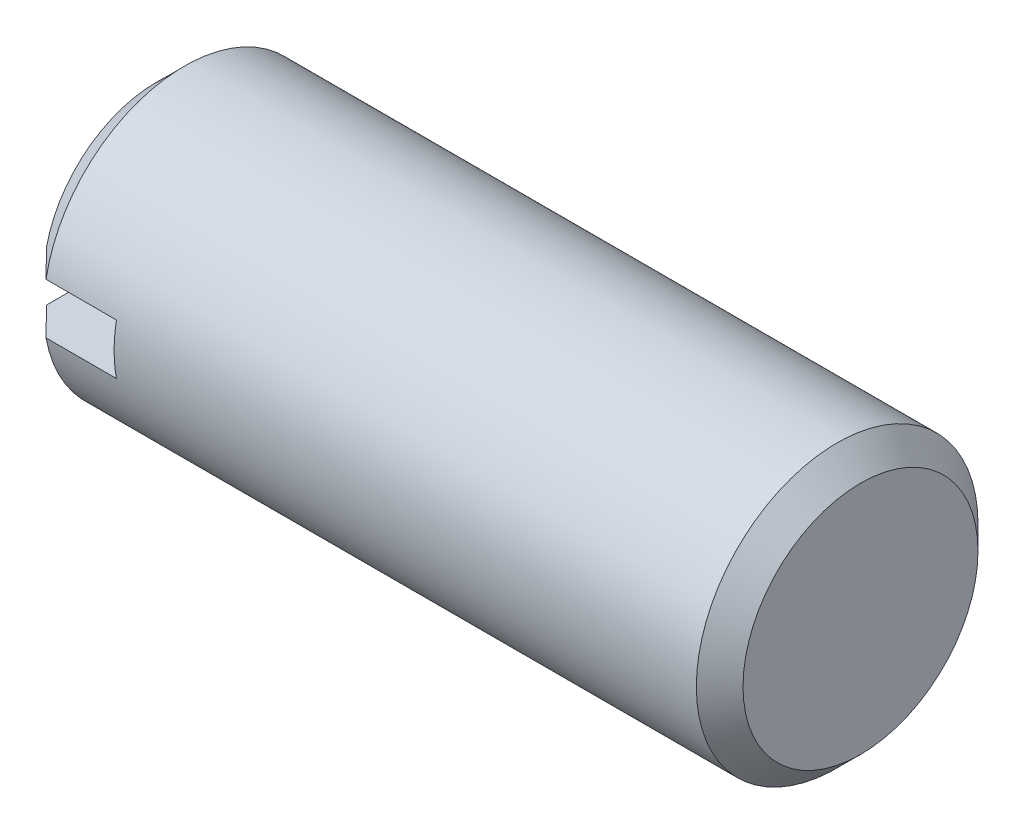
ISO-10303-21;
HEADER;
FILE_DESCRIPTION(('STEP AP214'),'2;1');
FILE_NAME('part.step','',(''),(''),'','','');
FILE_SCHEMA(('AUTOMOTIVE_DESIGN { 1 0 10303 214 1 1 1 1 }'));
ENDSEC;
DATA;
#1=APPLICATION_CONTEXT('core data for automotive mechanical design processes');
#2=APPLICATION_PROTOCOL_DEFINITION('international standard','automotive_design',2000,#1);
#3=PRODUCT_CONTEXT('',#1,'mechanical');
#4=PRODUCT('Part','Part','',(#3));
#5=PRODUCT_RELATED_PRODUCT_CATEGORY('part','',(#4));
#6=PRODUCT_DEFINITION_FORMATION('','',#4);
#7=PRODUCT_DEFINITION_CONTEXT('part definition',#1,'design');
#8=PRODUCT_DEFINITION('design','',#6,#7);
#9=PRODUCT_DEFINITION_SHAPE('','',#8);
#10=(LENGTH_UNIT() NAMED_UNIT(*) SI_UNIT(.MILLI.,.METRE.));
#11=(NAMED_UNIT(*) PLANE_ANGLE_UNIT() SI_UNIT($,.RADIAN.));
#12=(NAMED_UNIT(*) SI_UNIT($,.STERADIAN.) SOLID_ANGLE_UNIT());
#13=UNCERTAINTY_MEASURE_WITH_UNIT(LENGTH_MEASURE(1.E-05),#10,'distance_accuracy_value','');
#14=(GEOMETRIC_REPRESENTATION_CONTEXT(3) GLOBAL_UNCERTAINTY_ASSIGNED_CONTEXT((#13)) GLOBAL_UNIT_ASSIGNED_CONTEXT((#10,
#11,#12)) REPRESENTATION_CONTEXT('',''));
#15=CARTESIAN_POINT('',(0.,0.,0.));
#16=DIRECTION('',(0.,0.,1.));
#17=DIRECTION('',(1.,0.,0.));
#18=AXIS2_PLACEMENT_3D('',#15,#16,#17);
#19=CARTESIAN_POINT('',(0.,0.,0.));
#20=DIRECTION('',(-1.,0.,0.));
#21=DIRECTION('',(0.,0.,1.));
#22=AXIS2_PLACEMENT_3D('',#19,#20,#21);
#23=PLANE('',#22);
#24=DIRECTION('',(0.,0.,1.));
#25=VECTOR('',#24,1.);
#26=CARTESIAN_POINT('',(0.,0.9,-5.));
#27=LINE('',#26,#25);
#28=CARTESIAN_POINT('',(0.,0.9,-3.89743505398102));
#29=VERTEX_POINT('',#28);
#30=CARTESIAN_POINT('',(0.,0.9,3.89743505398102));
#31=VERTEX_POINT('',#30);
#32=EDGE_CURVE('E107',#29,#31,#27,.T.);
#33=ORIENTED_EDGE('',*,*,#32,.T.);
#34=CARTESIAN_POINT('',(0.,0.,0.));
#35=DIRECTION('',(-1.,0.,0.));
#36=DIRECTION('',(0.,0.,1.));
#37=AXIS2_PLACEMENT_3D('',#34,#35,#36);
#38=CIRCLE('',#37,4.);
#39=EDGE_CURVE('E95',#31,#29,#38,.T.);
#40=ORIENTED_EDGE('',*,*,#39,.T.);
#41=EDGE_LOOP('',(#33,#40));
#42=FACE_BOUND('',#41,.T.);
#43=ADVANCED_FACE('F32',(#42),#23,.T.);
#44=CARTESIAN_POINT('',(0.,0.,0.));
#45=DIRECTION('',(1.,0.,0.));
#46=DIRECTION('',(0.,0.,-1.));
#47=AXIS2_PLACEMENT_3D('',#44,#45,#46);
#48=CONICAL_SURFACE('',#47,4.,0.785398163397443);
#49=CARTESIAN_POINT('',(7.03012537267255,0.9,10.9933464303129));
#50=CARTESIAN_POINT('',(6.63966757322609,0.9,10.6015706341639));
#51=CARTESIAN_POINT('',(6.24926843018561,0.9,10.2097363094739));
#52=CARTESIAN_POINT('',(5.46864929228554,0.9,9.4258507538405));
#53=CARTESIAN_POINT('',(5.07842930721639,0.9,9.03379951314809));
#54=CARTESIAN_POINT('',(4.29780491007203,0.9,8.2489524542369));
#55=CARTESIAN_POINT('',(3.90740083067005,0.9,7.85615630504098));
#56=CARTESIAN_POINT('',(3.12704713270239,0.9,7.07015018946809));
#57=CARTESIAN_POINT('',(2.73709749322908,0.9,6.67694024385177));
#58=CARTESIAN_POINT('',(1.9790862064757,0.9,5.91120220689586));
#59=CARTESIAN_POINT('',(1.61098679634444,0.9,5.5387115345953));
#60=CARTESIAN_POINT('',(1.05967971113754,0.9,4.9790923375876));
#61=CARTESIAN_POINT('',(0.876037726528355,0.9,4.79239182808395));
#62=CARTESIAN_POINT('',(0.509170265698786,0.9,4.41858689609271));
#63=CARTESIAN_POINT('',(0.325944783842471,0.9,4.23148247913824));
#64=CARTESIAN_POINT('',(-0.0397740672911054,0.9,3.85681926652623));
#65=CARTESIAN_POINT('',(-0.222267865596271,0.9,3.66926089023119));
#66=CARTESIAN_POINT('',(-0.586330083039388,0.9,3.29322885592932));
#67=CARTESIAN_POINT('',(-0.767898452998071,0.9,3.10475515029816));
#68=CARTESIAN_POINT('',(-1.12946116157851,0.9,2.72638707320926));
#69=CARTESIAN_POINT('',(-1.30945588714665,0.9,2.5364930735902));
#70=CARTESIAN_POINT('',(-1.57726099928195,0.9,2.24962317812342));
#71=CARTESIAN_POINT('',(-1.66616118601363,0.9,2.1536658031648));
#72=CARTESIAN_POINT('',(-1.84289220064579,0.9,1.96077237031811));
#73=CARTESIAN_POINT('',(-1.93072306365372,0.9,1.86383634475273));
#74=CARTESIAN_POINT('',(-2.04199789169763,0.9,1.73894271287963));
#75=CARTESIAN_POINT('',(-2.06619519153897,0.9,1.71165610336254));
#76=CARTESIAN_POINT('',(-2.11444279633589,0.9,1.65695283505313));
#77=CARTESIAN_POINT('',(-2.13849309998892,0.9,1.62953617511221));
#78=CARTESIAN_POINT('',(-2.21039843477429,0.9,1.54706208393445));
#79=CARTESIAN_POINT('',(-2.2580032516844,0.9,1.49178573237919));
#80=CARTESIAN_POINT('',(-2.35275663752282,0.9,1.37996436666076));
#81=CARTESIAN_POINT('',(-2.39989697546545,0.9,1.32341235859334));
#82=CARTESIAN_POINT('',(-2.49291381506454,0.9,1.20929859706987));
#83=CARTESIAN_POINT('',(-2.5387906559781,0.9,1.15173712159249));
#84=CARTESIAN_POINT('',(-2.62920268259818,0.9,1.03464389772347));
#85=CARTESIAN_POINT('',(-2.6737199679498,0.9,0.975098240568322));
#86=CARTESIAN_POINT('',(-2.76007627070829,0.9,0.85394570719337));
#87=CARTESIAN_POINT('',(-2.80191166273553,0.9,0.792336205406337));
#88=CARTESIAN_POINT('',(-2.88088250681483,0.9,0.666924843820927));
#89=CARTESIAN_POINT('',(-2.91805737956406,0.9,0.603148133732882));
#90=CARTESIAN_POINT('',(-2.98530096271328,0.9,0.471982703642814));
#91=CARTESIAN_POINT('',(-3.01539165009706,0.9,0.404605971776878));
#92=CARTESIAN_POINT('',(-3.0488887688418,0.9,0.308587705908942));
#93=CARTESIAN_POINT('',(-3.05730277708238,0.9,0.281702150529634));
#94=CARTESIAN_POINT('',(-3.07209259704952,0.9,0.227377083828033));
#95=CARTESIAN_POINT('',(-3.07846834529499,0.9,0.199937555280678));
#96=CARTESIAN_POINT('',(-3.09401174244575,0.9,0.1171209841358));
#97=CARTESIAN_POINT('',(-3.09968136094391,0.9,0.0610145785720192));
#98=CARTESIAN_POINT('',(-3.10029333083145,0.9,-0.0514662860872499));
#99=CARTESIAN_POINT('',(-3.09519258720244,0.9,-0.107840918091645));
#100=CARTESIAN_POINT('',(-3.07538257028302,0.9,-0.218954817763408));
#101=CARTESIAN_POINT('',(-3.06064195197737,0.9,-0.27368813923689));
#102=CARTESIAN_POINT('',(-3.02277680781936,0.9,-0.384566677030676));
#103=CARTESIAN_POINT('',(-2.99911604479291,0.9,-0.440520355143913));
#104=CARTESIAN_POINT('',(-2.94640601173824,0.9,-0.549873320461539));
#105=CARTESIAN_POINT('',(-2.91734636858859,0.9,-0.603267437129518));
#106=CARTESIAN_POINT('',(-2.85545285459534,0.9,-0.708381667177104));
#107=CARTESIAN_POINT('',(-2.82258962935069,0.9,-0.76008418448982));
#108=CARTESIAN_POINT('',(-2.75448893188819,0.9,-0.861812330855669));
#109=CARTESIAN_POINT('',(-2.71925366590764,0.9,-0.91183945506104));
#110=CARTESIAN_POINT('',(-2.64368992908708,0.9,-1.01535458271116));
#111=CARTESIAN_POINT('',(-2.60319542375652,0.9,-1.06872054886737));
#112=CARTESIAN_POINT('',(-2.52079950780357,0.9,-1.17435884183594));
#113=CARTESIAN_POINT('',(-2.47889791449404,0.9,-1.2266310251975));
#114=CARTESIAN_POINT('',(-2.35165357835723,0.9,-1.38226463015266));
#115=CARTESIAN_POINT('',(-2.26480844159754,0.9,-1.48439389195012));
#116=CARTESIAN_POINT('',(-2.08871660927054,0.9,-1.68684867296463));
#117=CARTESIAN_POINT('',(-1.99946598971217,0.9,-1.78717073601509));
#118=CARTESIAN_POINT('',(-1.81955939067544,0.9,-1.98649442833882));
#119=CARTESIAN_POINT('',(-1.72890380590963,0.9,-2.08549641443964));
#120=CARTESIAN_POINT('',(-1.54699288299959,0.9,-2.28224352425935));
#121=CARTESIAN_POINT('',(-1.4557411662199,0.9,-2.37999200738661));
#122=CARTESIAN_POINT('',(-1.27257057040931,0.9,-2.57487399951201));
#123=CARTESIAN_POINT('',(-1.18065164538058,0.9,-2.67200746522927));
#124=CARTESIAN_POINT('',(-0.99642863713768,0.9,-2.86571716139053));
#125=CARTESIAN_POINT('',(-0.904125049237001,0.9,-2.96229386341113));
#126=CARTESIAN_POINT('',(-0.71915969597056,0.9,-3.15509916310874));
#127=CARTESIAN_POINT('',(-0.626497938901846,0.9,-3.25132776875068));
#128=CARTESIAN_POINT('',(-0.378023452921377,0.9,-3.50862901926684));
#129=CARTESIAN_POINT('',(-0.221961331040414,0.9,-3.66946075027121));
#130=CARTESIAN_POINT('',(0.0906838973891251,0.9,-3.99061724059509));
#131=CARTESIAN_POINT('',(0.247267005279253,0.9,-4.15094199860707));
#132=CARTESIAN_POINT('',(0.717564511687379,0.9,-4.63138888244943));
#133=CARTESIAN_POINT('',(1.03182241449658,0.9,-4.95097879520431));
#134=CARTESIAN_POINT('',(1.66127792394471,0.9,-5.58953327870619));
#135=CARTESIAN_POINT('',(1.97647590935281,0.9,-5.9084974754855));
#136=CARTESIAN_POINT('',(2.60736097342592,0.9,-6.54593750537648));
#137=CARTESIAN_POINT('',(2.92304804878349,0.9,-6.86441334176195));
#138=CARTESIAN_POINT('',(3.55448673992236,0.9,-7.50078813877519));
#139=CARTESIAN_POINT('',(3.87023809537333,0.9,-7.81868735781785));
#140=CARTESIAN_POINT('',(4.50196382317652,0.9,-8.45426552915944));
#141=CARTESIAN_POINT('',(4.81793819602855,0.9,-8.77194448096153));
#142=CARTESIAN_POINT('',(5.44988114338006,0.9,-9.40697802324338));
#143=CARTESIAN_POINT('',(5.76584963473418,0.9,-9.72433269647563));
#144=CARTESIAN_POINT('',(6.39790674884051,0.9,-10.3589208122648));
#145=CARTESIAN_POINT('',(6.71399537128982,0.9,-10.6761542551233));
#146=CARTESIAN_POINT('',(7.03012537267255,0.9,-10.9933464303129));
#147=B_SPLINE_CURVE_WITH_KNOTS('',3,(#49,#50,#51,#52,#53,#54,#55,#56,#57,#58,#59,#60,#61,#62,
#63,#64,#65,#66,#67,#68,#69,#70,#71,#72,#73,#74,#75,#76,#77,#78,#79,#80,#81,#82,#83,#84,#85,#86,
#87,#88,#89,#90,#91,#92,#93,#94,#95,#96,#97,#98,#99,#100,#101,#102,#103,#104,#105,#106,#107,
#108,#109,#110,#111,#112,#113,#114,#115,#116,#117,#118,#119,#120,#121,#122,#123,#124,#125,#126,
#127,#128,#129,#130,#131,#132,#133,#134,#135,#136,#137,#138,#139,#140,#141,#142,#143,#144,#145,
#146),.UNSPECIFIED.,.F.,.F.,(4,2,2,2,2,2,2,2,2,2,2,2,2,2,2,2,2,2,2,2,2,2,2,2,2,2,2,2,2,2,2,2,2,
2,2,2,2,2,2,2,2,2,2,2,2,2,2,2,4),(0.,1.65937046051036,3.31882280083583,4.98024888771122,
6.64159525404272,8.21264999743852,8.99829138998156,9.78392208752001,10.5689923336695,
11.3541038740221,12.139016601865,12.5314400031145,12.9238504856013,13.0332603329796,
13.1426711484589,13.3615136618393,13.5823702215591,13.8031668900008,14.0261613630448,
14.2494511856535,14.4707025132235,14.6912581405588,14.775701077676,14.8601466444908,
15.0283060916995,15.1971396633141,15.3665249621524,15.5483506132622,15.7305292968105,
15.9142217365741,16.097745623341,16.2986837962079,16.4996481592195,16.9017617413284,
17.304576574099,17.7072802204354,18.108443226414,18.5096341566333,18.9104111036027,
19.3111788214918,19.9834863490292,20.6557956091184,22.0004342867601,23.345718636195,
24.6909939275653,26.035177374929,27.3793638444073,28.722848341114,30.0663294725719),.UNSPECIFIED.);
#148=CARTESIAN_POINT('',(1.00000000000001,0.9,4.91833305094318));
#149=VERTEX_POINT('',#148);
#150=EDGE_CURVE('E118',#149,#31,#147,.T.);
#151=ORIENTED_EDGE('',*,*,#150,.F.);
#152=CARTESIAN_POINT('',(1.00000000000001,0.,0.));
#153=DIRECTION('',(-1.,0.,0.));
#154=DIRECTION('',(0.,0.,1.));
#155=AXIS2_PLACEMENT_3D('',#152,#153,#154);
#156=CIRCLE('',#155,5.);
#157=CARTESIAN_POINT('',(1.00000000000001,0.9,-4.91833305094318));
#158=VERTEX_POINT('',#157);
#159=EDGE_CURVE('E161',#149,#158,#156,.T.);
#160=ORIENTED_EDGE('',*,*,#159,.T.);
#161=EDGE_CURVE('E55',#29,#158,#147,.T.);
#162=ORIENTED_EDGE('',*,*,#161,.F.);
#163=ORIENTED_EDGE('',*,*,#39,.F.);
#164=EDGE_LOOP('',(#151,#160,#162,#163));
#165=FACE_BOUND('',#164,.T.);
#166=ADVANCED_FACE('F144',(#165),#48,.T.);
#167=DIRECTION('',(0.,0.,1.));
#168=VECTOR('',#167,1.);
#169=CARTESIAN_POINT('',(0.,-0.9,-5.));
#170=LINE('',#169,#168);
#171=CARTESIAN_POINT('',(0.,-0.9,-3.89743505398102));
#172=VERTEX_POINT('',#171);
#173=CARTESIAN_POINT('',(0.,-0.9,3.89743505398102));
#174=VERTEX_POINT('',#173);
#175=EDGE_CURVE('E105',#172,#174,#170,.T.);
#176=ORIENTED_EDGE('',*,*,#175,.F.);
#177=EDGE_CURVE('E159',#172,#174,#38,.T.);
#178=ORIENTED_EDGE('',*,*,#177,.T.);
#179=EDGE_LOOP('',(#176,#178));
#180=FACE_BOUND('',#179,.T.);
#181=ADVANCED_FACE('F34',(#180),#23,.T.);
#182=CARTESIAN_POINT('',(7.03012537267255,-0.9,-10.9933464303129));
#183=CARTESIAN_POINT('',(6.63966757322609,-0.9,-10.6015706341639));
#184=CARTESIAN_POINT('',(6.2492684301856,-0.9,-10.2097363094739));
#185=CARTESIAN_POINT('',(5.46864929228554,-0.9,-9.4258507538405));
#186=CARTESIAN_POINT('',(5.07842930721638,-0.9,-9.03379951314809));
#187=CARTESIAN_POINT('',(4.29780491007203,-0.9,-8.2489524542369));
#188=CARTESIAN_POINT('',(3.90740083067005,-0.9,-7.85615630504098));
#189=CARTESIAN_POINT('',(3.12704713270239,-0.9,-7.07015018946809));
#190=CARTESIAN_POINT('',(2.73709749322908,-0.9,-6.67694024385177));
#191=CARTESIAN_POINT('',(1.9790862064757,-0.9,-5.91120220689586));
#192=CARTESIAN_POINT('',(1.61098679634444,-0.9,-5.5387115345953));
#193=CARTESIAN_POINT('',(1.05967971113754,-0.9,-4.9790923375876));
#194=CARTESIAN_POINT('',(0.876037726528355,-0.9,-4.79239182808395));
#195=CARTESIAN_POINT('',(0.509170265698785,-0.9,-4.41858689609271));
#196=CARTESIAN_POINT('',(0.325944783842471,-0.9,-4.23148247913824));
#197=CARTESIAN_POINT('',(-0.039774067291106,-0.9,-3.85681926652623));
#198=CARTESIAN_POINT('',(-0.222267865596271,-0.9,-3.66926089023119));
#199=CARTESIAN_POINT('',(-0.586330083039389,-0.9,-3.29322885592932));
#200=CARTESIAN_POINT('',(-0.767898452998072,-0.9,-3.10475515029816));
#201=CARTESIAN_POINT('',(-1.12946116157852,-0.9,-2.72638707320926));
#202=CARTESIAN_POINT('',(-1.30945588714665,-0.9,-2.5364930735902));
#203=CARTESIAN_POINT('',(-1.57726099928195,-0.9,-2.24962317812342));
#204=CARTESIAN_POINT('',(-1.66616118601364,-0.9,-2.1536658031648));
#205=CARTESIAN_POINT('',(-1.8428922006458,-0.9,-1.9607723703181));
#206=CARTESIAN_POINT('',(-1.93072306365372,-0.9,-1.86383634475273));
#207=CARTESIAN_POINT('',(-2.04199789169764,-0.9,-1.73894271287962));
#208=CARTESIAN_POINT('',(-2.06619519153897,-0.9,-1.71165610336254));
#209=CARTESIAN_POINT('',(-2.11444279633589,-0.9,-1.65695283505313));
#210=CARTESIAN_POINT('',(-2.13849309998892,-0.9,-1.62953617511221));
#211=CARTESIAN_POINT('',(-2.21039843477429,-0.9,-1.54706208393445));
#212=CARTESIAN_POINT('',(-2.25800325168441,-0.9,-1.49178573237919));
#213=CARTESIAN_POINT('',(-2.35275663752282,-0.9,-1.37996436666076));
#214=CARTESIAN_POINT('',(-2.39989697546545,-0.9,-1.32341235859334));
#215=CARTESIAN_POINT('',(-2.49291381506454,-0.9,-1.20929859706987));
#216=CARTESIAN_POINT('',(-2.5387906559781,-0.9,-1.15173712159249));
#217=CARTESIAN_POINT('',(-2.62920268259818,-0.9,-1.03464389772346));
#218=CARTESIAN_POINT('',(-2.6737199679498,-0.9,-0.97509824056832));
#219=CARTESIAN_POINT('',(-2.76007627070829,-0.9,-0.853945707193368));
#220=CARTESIAN_POINT('',(-2.80191166273553,-0.9,-0.792336205406336));
#221=CARTESIAN_POINT('',(-2.88088250681483,-0.9,-0.666924843820927));
#222=CARTESIAN_POINT('',(-2.91805737956406,-0.9,-0.603148133732883));
#223=CARTESIAN_POINT('',(-2.98530096271328,-0.9,-0.471982703642816));
#224=CARTESIAN_POINT('',(-3.01539165009706,-0.9,-0.404605971776879));
#225=CARTESIAN_POINT('',(-3.0488887688418,-0.9,-0.308587705908942));
#226=CARTESIAN_POINT('',(-3.05730277708238,-0.9,-0.281702150529634));
#227=CARTESIAN_POINT('',(-3.07209259704952,-0.9,-0.227377083828032));
#228=CARTESIAN_POINT('',(-3.07846834529499,-0.9,-0.199937555280677));
#229=CARTESIAN_POINT('',(-3.09401174244575,-0.9,-0.117120984135799));
#230=CARTESIAN_POINT('',(-3.09968136094391,-0.9,-0.0610145785720186));
#231=CARTESIAN_POINT('',(-3.10029333083145,-0.9,0.05146628608725));
#232=CARTESIAN_POINT('',(-3.09519258720244,-0.9,0.107840918091645));
#233=CARTESIAN_POINT('',(-3.07538257028302,-0.9,0.218954817763408));
#234=CARTESIAN_POINT('',(-3.06064195197737,-0.9,0.273688139236891));
#235=CARTESIAN_POINT('',(-3.02277680781936,-0.9,0.384566677030676));
#236=CARTESIAN_POINT('',(-2.99911604479291,-0.9,0.440520355143914));
#237=CARTESIAN_POINT('',(-2.94640601173824,-0.9,0.549873320461539));
#238=CARTESIAN_POINT('',(-2.91734636858859,-0.9,0.60326743712952));
#239=CARTESIAN_POINT('',(-2.85545285459534,-0.9,0.708381667177105));
#240=CARTESIAN_POINT('',(-2.82258962935069,-0.9,0.760084184489821));
#241=CARTESIAN_POINT('',(-2.75448893188819,-0.9,0.861812330855669));
#242=CARTESIAN_POINT('',(-2.71925366590764,-0.9,0.911839455061041));
#243=CARTESIAN_POINT('',(-2.64368992908708,-0.9,1.01535458271116));
#244=CARTESIAN_POINT('',(-2.60319542375652,-0.9,1.06872054886736));
#245=CARTESIAN_POINT('',(-2.52079950780357,-0.9,1.17435884183593));
#246=CARTESIAN_POINT('',(-2.47889791449405,-0.9,1.2266310251975));
#247=CARTESIAN_POINT('',(-2.35165357835723,-0.9,1.38226463015265));
#248=CARTESIAN_POINT('',(-2.26480844159754,-0.9,1.48439389195012));
#249=CARTESIAN_POINT('',(-2.08871660927054,-0.9,1.68684867296463));
#250=CARTESIAN_POINT('',(-1.99946598971217,-0.9,1.78717073601509));
#251=CARTESIAN_POINT('',(-1.81955939067544,-0.9,1.98649442833882));
#252=CARTESIAN_POINT('',(-1.72890380590963,-0.9,2.08549641443964));
#253=CARTESIAN_POINT('',(-1.54699288299959,-0.9,2.28224352425935));
#254=CARTESIAN_POINT('',(-1.4557411662199,-0.9,2.37999200738661));
#255=CARTESIAN_POINT('',(-1.27257057040931,-0.9,2.57487399951201));
#256=CARTESIAN_POINT('',(-1.18065164538058,-0.9,2.67200746522927));
#257=CARTESIAN_POINT('',(-0.996428637137679,-0.9,2.86571716139053));
#258=CARTESIAN_POINT('',(-0.904125049237,-0.9,2.96229386341113));
#259=CARTESIAN_POINT('',(-0.719159695970558,-0.9,3.15509916310874));
#260=CARTESIAN_POINT('',(-0.626497938901844,-0.9,3.25132776875068));
#261=CARTESIAN_POINT('',(-0.378023452921373,-0.9,3.50862901926684));
#262=CARTESIAN_POINT('',(-0.221961331040409,-0.9,3.66946075027121));
#263=CARTESIAN_POINT('',(0.0906838973891297,-0.9,3.9906172405951));
#264=CARTESIAN_POINT('',(0.247267005279258,-0.9,4.15094199860707));
#265=CARTESIAN_POINT('',(0.717564511687383,-0.9,4.63138888244943));
#266=CARTESIAN_POINT('',(1.03182241449658,-0.9,4.95097879520431));
#267=CARTESIAN_POINT('',(1.66127792394471,-0.9,5.58953327870619));
#268=CARTESIAN_POINT('',(1.97647590935281,-0.9,5.9084974754855));
#269=CARTESIAN_POINT('',(2.60736097342593,-0.9,6.54593750537648));
#270=CARTESIAN_POINT('',(2.92304804878349,-0.9,6.86441334176195));
#271=CARTESIAN_POINT('',(3.55448673992236,-0.9,7.50078813877519));
#272=CARTESIAN_POINT('',(3.87023809537333,-0.9,7.81868735781785));
#273=CARTESIAN_POINT('',(4.50196382317652,-0.9,8.45426552915944));
#274=CARTESIAN_POINT('',(4.81793819602855,-0.9,8.77194448096153));
#275=CARTESIAN_POINT('',(5.44988114338006,-0.9,9.40697802324338));
#276=CARTESIAN_POINT('',(5.76584963473417,-0.9,9.72433269647562));
#277=CARTESIAN_POINT('',(6.3979067488405,-0.9,10.3589208122648));
#278=CARTESIAN_POINT('',(6.71399537128982,-0.9,10.6761542551233));
#279=CARTESIAN_POINT('',(7.03012537267255,-0.9,10.9933464303129));
#280=B_SPLINE_CURVE_WITH_KNOTS('',3,(#182,#183,#184,#185,#186,#187,#188,#189,#190,#191,#192,
#193,#194,#195,#196,#197,#198,#199,#200,#201,#202,#203,#204,#205,#206,#207,#208,#209,#210,#211,
#212,#213,#214,#215,#216,#217,#218,#219,#220,#221,#222,#223,#224,#225,#226,#227,#228,#229,#230,
#231,#232,#233,#234,#235,#236,#237,#238,#239,#240,#241,#242,#243,#244,#245,#246,#247,#248,#249,
#250,#251,#252,#253,#254,#255,#256,#257,#258,#259,#260,#261,#262,#263,#264,#265,#266,#267,#268,
#269,#270,#271,#272,#273,#274,#275,#276,#277,#278,#279),.UNSPECIFIED.,.F.,.F.,(4,2,2,2,2,2,2,2,
2,2,2,2,2,2,2,2,2,2,2,2,2,2,2,2,2,2,2,2,2,2,2,2,2,2,2,2,2,2,2,2,2,2,2,2,2,2,2,2,4),(0.,
1.65937046051036,3.31882280083583,4.98024888771122,6.64159525404272,8.21264999743852,
8.99829138998156,9.78392208752,10.5689923336695,11.3541038740221,12.139016601865,
12.5314400031145,12.9238504856013,13.0332603329796,13.1426711484589,13.3615136618393,
13.5823702215591,13.8031668900008,14.0261613630448,14.2494511856535,14.4707025132235,
14.6912581405588,14.775701077676,14.8601466444908,15.0283060916995,15.1971396633141,
15.3665249621524,15.5483506132622,15.7305292968105,15.9142217365741,16.097745623341,
16.2986837962079,16.4996481592195,16.9017617413284,17.304576574099,17.7072802204354,
18.108443226414,18.5096341566333,18.9104111036027,19.3111788214918,19.9834863490292,
20.6557956091184,22.0004342867601,23.345718636195,24.6909939275653,26.035177374929,
27.3793638444073,28.722848341114,30.0663294725719),.UNSPECIFIED.);
#281=CARTESIAN_POINT('',(1.00000000000001,-0.9,-4.91833305094318));
#282=VERTEX_POINT('',#281);
#283=EDGE_CURVE('E112',#282,#172,#280,.T.);
#284=ORIENTED_EDGE('',*,*,#283,.F.);
#285=CARTESIAN_POINT('',(1.00000000000001,-0.9,4.91833305094318));
#286=VERTEX_POINT('',#285);
#287=EDGE_CURVE('E165',#282,#286,#156,.T.);
#288=ORIENTED_EDGE('',*,*,#287,.T.);
#289=EDGE_CURVE('E102',#174,#286,#280,.T.);
#290=ORIENTED_EDGE('',*,*,#289,.F.);
#291=ORIENTED_EDGE('',*,*,#177,.F.);
#292=EDGE_LOOP('',(#284,#288,#290,#291));
#293=FACE_BOUND('',#292,.T.);
#294=ADVANCED_FACE('F124',(#293),#48,.T.);
#295=CARTESIAN_POINT('',(-3.67611336032393,0.,0.));
#296=DIRECTION('',(-1.,0.,0.));
#297=DIRECTION('',(0.,0.,1.));
#298=AXIS2_PLACEMENT_3D('',#295,#296,#297);
#299=CYLINDRICAL_SURFACE('',#298,5.);
#300=CARTESIAN_POINT('',(3.5,0.,0.));
#301=DIRECTION('',(1.,0.,0.));
#302=DIRECTION('',(0.,0.,-1.));
#303=AXIS2_PLACEMENT_3D('',#300,#301,#302);
#304=CIRCLE('',#303,5.);
#305=CARTESIAN_POINT('',(3.5,-0.9,4.91833305094318));
#306=VERTEX_POINT('',#305);
#307=CARTESIAN_POINT('',(3.5,0.9,4.91833305094318));
#308=VERTEX_POINT('',#307);
#309=EDGE_CURVE('E87',#306,#308,#304,.F.);
#310=ORIENTED_EDGE('',*,*,#309,.F.);
#311=DIRECTION('',(-1.,0.,0.));
#312=VECTOR('',#311,1.);
#313=CARTESIAN_POINT('',(-3.67611336032393,-0.9,4.91833305094318));
#314=LINE('',#313,#312);
#315=EDGE_CURVE('E11',#286,#306,#314,.F.);
#316=ORIENTED_EDGE('',*,*,#315,.F.);
#317=ORIENTED_EDGE('',*,*,#287,.F.);
#318=DIRECTION('',(-1.,0.,0.));
#319=VECTOR('',#318,1.);
#320=CARTESIAN_POINT('',(-3.67611336032393,-0.9,-4.91833305094318));
#321=LINE('',#320,#319);
#322=CARTESIAN_POINT('',(3.5,-0.9,-4.91833305094318));
#323=VERTEX_POINT('',#322);
#324=EDGE_CURVE('E40',#323,#282,#321,.T.);
#325=ORIENTED_EDGE('',*,*,#324,.F.);
#326=CARTESIAN_POINT('',(3.5,0.9,-4.91833305094318));
#327=VERTEX_POINT('',#326);
#328=EDGE_CURVE('E47',#327,#323,#304,.F.);
#329=ORIENTED_EDGE('',*,*,#328,.F.);
#330=DIRECTION('',(-1.,0.,0.));
#331=VECTOR('',#330,1.);
#332=CARTESIAN_POINT('',(-3.67611336032393,0.9,-4.91833305094318));
#333=LINE('',#332,#331);
#334=EDGE_CURVE('E170',#158,#327,#333,.F.);
#335=ORIENTED_EDGE('',*,*,#334,.F.);
#336=ORIENTED_EDGE('',*,*,#159,.F.);
#337=DIRECTION('',(-1.,0.,0.));
#338=VECTOR('',#337,1.);
#339=CARTESIAN_POINT('',(-3.67611336032393,0.9,4.91833305094318));
#340=LINE('',#339,#338);
#341=EDGE_CURVE('E93',#308,#149,#340,.T.);
#342=ORIENTED_EDGE('',*,*,#341,.F.);
#343=EDGE_LOOP('',(#310,#316,#317,#325,#329,#335,#336,#342));
#344=FACE_BOUND('',#343,.T.);
#345=CARTESIAN_POINT('',(24.1719999999999,0.,0.));
#346=DIRECTION('',(-1.,0.,0.));
#347=DIRECTION('',(0.,0.,1.));
#348=AXIS2_PLACEMENT_3D('',#345,#346,#347);
#349=CIRCLE('',#348,5.);
#350=CARTESIAN_POINT('',(24.1719999999999,0.,5.));
#351=VERTEX_POINT('',#350);
#352=EDGE_CURVE('E171',#351,#351,#349,.T.);
#353=ORIENTED_EDGE('',*,*,#352,.T.);
#354=EDGE_LOOP('',(#353));
#355=FACE_BOUND('',#354,.T.);
#356=ADVANCED_FACE('F88',(#344,#355),#299,.T.);
#357=CARTESIAN_POINT('',(25.,0.,0.));
#358=DIRECTION('',(-1.,0.,0.));
#359=DIRECTION('',(0.,0.,1.));
#360=AXIS2_PLACEMENT_3D('',#357,#358,#359);
#361=CONICAL_SURFACE('',#360,4.17200000000002,0.785398163397373);
#362=ORIENTED_EDGE('',*,*,#352,.F.);
#363=EDGE_LOOP('',(#362));
#364=FACE_BOUND('',#363,.T.);
#365=CARTESIAN_POINT('',(25.,0.,0.));
#366=DIRECTION('',(-1.,0.,0.));
#367=DIRECTION('',(0.,0.,1.));
#368=AXIS2_PLACEMENT_3D('',#365,#366,#367);
#369=CIRCLE('',#368,4.17200000000002);
#370=CARTESIAN_POINT('',(25.,0.,4.17200000000002));
#371=VERTEX_POINT('',#370);
#372=EDGE_CURVE('E173',#371,#371,#369,.T.);
#373=ORIENTED_EDGE('',*,*,#372,.T.);
#374=EDGE_LOOP('',(#373));
#375=FACE_BOUND('',#374,.T.);
#376=ADVANCED_FACE('F135',(#364,#375),#361,.T.);
#377=CARTESIAN_POINT('',(25.,4.17200000000002,0.));
#378=DIRECTION('',(1.,0.,0.));
#379=DIRECTION('',(0.,0.,-1.));
#380=AXIS2_PLACEMENT_3D('',#377,#378,#379);
#381=PLANE('',#380);
#382=ORIENTED_EDGE('',*,*,#372,.F.);
#383=EDGE_LOOP('',(#382));
#384=FACE_BOUND('',#383,.T.);
#385=ADVANCED_FACE('F131',(#384),#381,.T.);
#386=CARTESIAN_POINT('',(0.,0.9,-5.));
#387=DIRECTION('',(0.,1.,0.));
#388=DIRECTION('',(-1.,0.,0.));
#389=AXIS2_PLACEMENT_3D('',#386,#387,#388);
#390=PLANE('',#389);
#391=ORIENTED_EDGE('',*,*,#161,.T.);
#392=ORIENTED_EDGE('',*,*,#334,.T.);
#393=DIRECTION('',(0.,0.,1.));
#394=VECTOR('',#393,1.);
#395=CARTESIAN_POINT('',(3.5,0.9,-5.));
#396=LINE('',#395,#394);
#397=EDGE_CURVE('E104',#327,#308,#396,.T.);
#398=ORIENTED_EDGE('',*,*,#397,.T.);
#399=ORIENTED_EDGE('',*,*,#341,.T.);
#400=ORIENTED_EDGE('',*,*,#150,.T.);
#401=ORIENTED_EDGE('',*,*,#32,.F.);
#402=EDGE_LOOP('',(#391,#392,#398,#399,#400,#401));
#403=FACE_BOUND('',#402,.T.);
#404=ADVANCED_FACE('F134',(#403),#390,.F.);
#405=CARTESIAN_POINT('',(3.5,0.9,-5.));
#406=DIRECTION('',(1.,0.,0.));
#407=DIRECTION('',(0.,0.,-1.));
#408=AXIS2_PLACEMENT_3D('',#405,#406,#407);
#409=PLANE('',#408);
#410=DIRECTION('',(0.,0.,1.));
#411=VECTOR('',#410,1.);
#412=CARTESIAN_POINT('',(3.5,-0.9,-5.));
#413=LINE('',#412,#411);
#414=EDGE_CURVE('E99',#323,#306,#413,.T.);
#415=ORIENTED_EDGE('',*,*,#414,.T.);
#416=ORIENTED_EDGE('',*,*,#309,.T.);
#417=ORIENTED_EDGE('',*,*,#397,.F.);
#418=ORIENTED_EDGE('',*,*,#328,.T.);
#419=EDGE_LOOP('',(#415,#416,#417,#418));
#420=FACE_BOUND('',#419,.T.);
#421=ADVANCED_FACE('F103',(#420),#409,.F.);
#422=CARTESIAN_POINT('',(0.,-0.9,-5.));
#423=DIRECTION('',(0.,-1.,0.));
#424=DIRECTION('',(0.,0.,-1.));
#425=AXIS2_PLACEMENT_3D('',#422,#423,#424);
#426=PLANE('',#425);
#427=ORIENTED_EDGE('',*,*,#289,.T.);
#428=ORIENTED_EDGE('',*,*,#315,.T.);
#429=ORIENTED_EDGE('',*,*,#414,.F.);
#430=ORIENTED_EDGE('',*,*,#324,.T.);
#431=ORIENTED_EDGE('',*,*,#283,.T.);
#432=ORIENTED_EDGE('',*,*,#175,.T.);
#433=EDGE_LOOP('',(#427,#428,#429,#430,#431,#432));
#434=FACE_BOUND('',#433,.T.);
#435=ADVANCED_FACE('F98',(#434),#426,.F.);
#436=CLOSED_SHELL('',(#43,#166,#181,#294,#356,#376,#385,#404,#421,#435));
#437=MANIFOLD_SOLID_BREP('B2',#436);
#438=ADVANCED_BREP_SHAPE_REPRESENTATION('',(#18,#437),#14);
#439=SHAPE_DEFINITION_REPRESENTATION(#9,#438);
ENDSEC;
END-ISO-10303-21;
